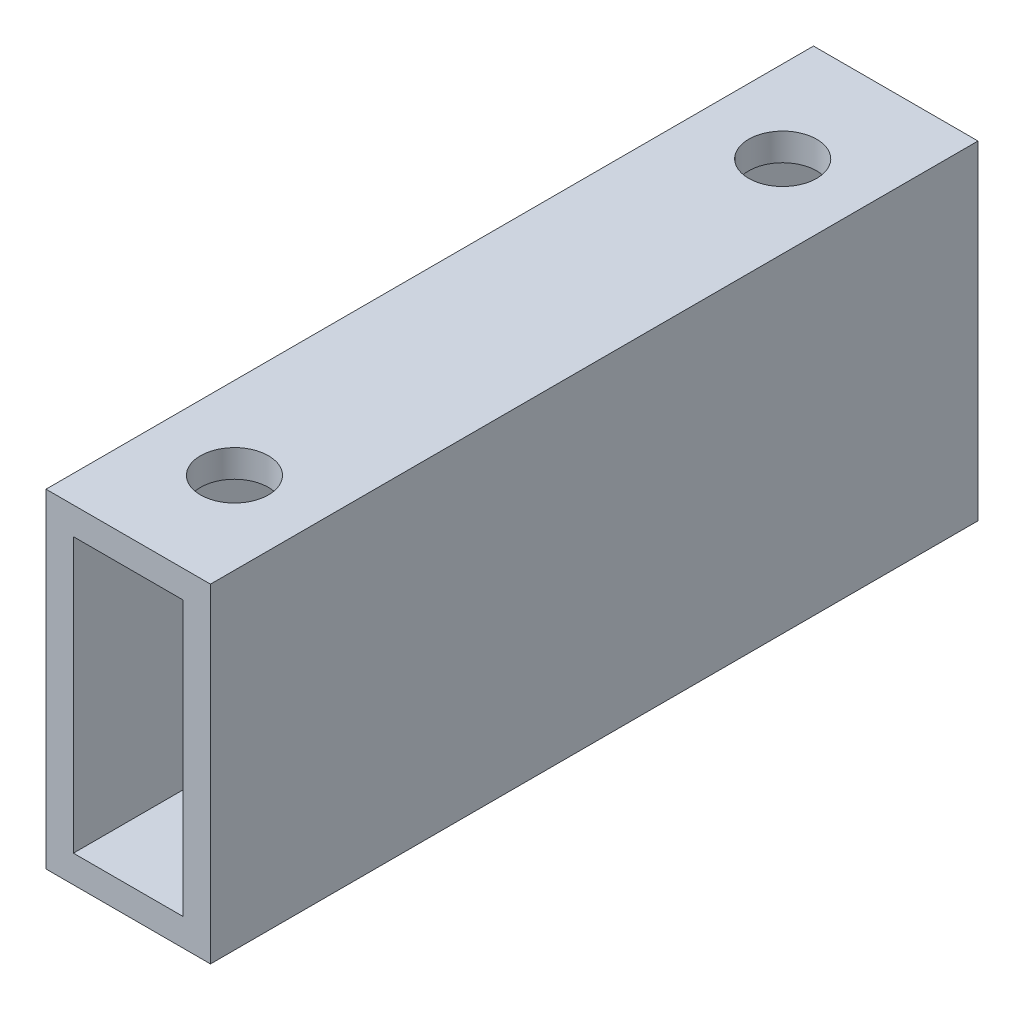
ISO-10303-21;
HEADER;
FILE_DESCRIPTION(('STEP AP214'),'2;1');
FILE_NAME('part.step','',(''),(''),'','','');
FILE_SCHEMA(('AUTOMOTIVE_DESIGN { 1 0 10303 214 1 1 1 1 }'));
ENDSEC;
DATA;
#1=APPLICATION_CONTEXT('core data for automotive mechanical design processes');
#2=APPLICATION_PROTOCOL_DEFINITION('international standard','automotive_design',2000,#1);
#3=PRODUCT_CONTEXT('',#1,'mechanical');
#4=PRODUCT('Part','Part','',(#3));
#5=PRODUCT_RELATED_PRODUCT_CATEGORY('part','',(#4));
#6=PRODUCT_DEFINITION_FORMATION('','',#4);
#7=PRODUCT_DEFINITION_CONTEXT('part definition',#1,'design');
#8=PRODUCT_DEFINITION('design','',#6,#7);
#9=PRODUCT_DEFINITION_SHAPE('','',#8);
#10=(LENGTH_UNIT() NAMED_UNIT(*) SI_UNIT(.MILLI.,.METRE.));
#11=(NAMED_UNIT(*) PLANE_ANGLE_UNIT() SI_UNIT($,.RADIAN.));
#12=(NAMED_UNIT(*) SI_UNIT($,.STERADIAN.) SOLID_ANGLE_UNIT());
#13=UNCERTAINTY_MEASURE_WITH_UNIT(LENGTH_MEASURE(1.E-05),#10,'distance_accuracy_value','');
#14=(GEOMETRIC_REPRESENTATION_CONTEXT(3) GLOBAL_UNCERTAINTY_ASSIGNED_CONTEXT((#13)) GLOBAL_UNIT_ASSIGNED_CONTEXT((#10,
#11,#12)) REPRESENTATION_CONTEXT('',''));
#15=CARTESIAN_POINT('',(0.,0.,0.));
#16=DIRECTION('',(0.,0.,1.));
#17=DIRECTION('',(1.,0.,0.));
#18=AXIS2_PLACEMENT_3D('',#15,#16,#17);
#19=CARTESIAN_POINT('',(0.,0.,88.9));
#20=DIRECTION('',(0.,0.,-1.));
#21=DIRECTION('',(-1.,0.,0.));
#22=AXIS2_PLACEMENT_3D('',#19,#20,#21);
#23=PLANE('',#22);
#24=DIRECTION('',(0.,1.,0.));
#25=VECTOR('',#24,1.);
#26=CARTESIAN_POINT('',(9.525,-19.05,88.9));
#27=LINE('',#26,#25);
#28=CARTESIAN_POINT('',(9.525,-19.05,88.9));
#29=VERTEX_POINT('',#28);
#30=CARTESIAN_POINT('',(9.525,19.05,88.9));
#31=VERTEX_POINT('',#30);
#32=EDGE_CURVE('E136',#29,#31,#27,.T.);
#33=ORIENTED_EDGE('',*,*,#32,.T.);
#34=DIRECTION('',(-1.,0.,0.));
#35=VECTOR('',#34,1.);
#36=CARTESIAN_POINT('',(-9.525,19.05,88.9));
#37=LINE('',#36,#35);
#38=CARTESIAN_POINT('',(-9.525,19.05,88.9));
#39=VERTEX_POINT('',#38);
#40=EDGE_CURVE('E139',#31,#39,#37,.T.);
#41=ORIENTED_EDGE('',*,*,#40,.T.);
#42=DIRECTION('',(0.,-1.,0.));
#43=VECTOR('',#42,1.);
#44=CARTESIAN_POINT('',(-9.525,-19.05,88.9));
#45=LINE('',#44,#43);
#46=CARTESIAN_POINT('',(-9.525,-19.05,88.9));
#47=VERTEX_POINT('',#46);
#48=EDGE_CURVE('E142',#39,#47,#45,.T.);
#49=ORIENTED_EDGE('',*,*,#48,.T.);
#50=DIRECTION('',(1.,0.,0.));
#51=VECTOR('',#50,1.);
#52=CARTESIAN_POINT('',(-9.525,-19.05,88.9));
#53=LINE('',#52,#51);
#54=EDGE_CURVE('E144',#47,#29,#53,.T.);
#55=ORIENTED_EDGE('',*,*,#54,.T.);
#56=EDGE_LOOP('',(#33,#41,#49,#55));
#57=FACE_BOUND('',#56,.T.);
#58=DIRECTION('',(1.,0.,0.));
#59=VECTOR('',#58,1.);
#60=CARTESIAN_POINT('',(-6.35,-15.875,88.9));
#61=LINE('',#60,#59);
#62=CARTESIAN_POINT('',(-6.35,-15.875,88.9));
#63=VERTEX_POINT('',#62);
#64=CARTESIAN_POINT('',(6.35,-15.875,88.9));
#65=VERTEX_POINT('',#64);
#66=EDGE_CURVE('E98',#63,#65,#61,.T.);
#67=ORIENTED_EDGE('',*,*,#66,.F.);
#68=DIRECTION('',(0.,-1.,0.));
#69=VECTOR('',#68,1.);
#70=CARTESIAN_POINT('',(-6.35,-15.875,88.9));
#71=LINE('',#70,#69);
#72=CARTESIAN_POINT('',(-6.35,15.875,88.9));
#73=VERTEX_POINT('',#72);
#74=EDGE_CURVE('E120',#73,#63,#71,.T.);
#75=ORIENTED_EDGE('',*,*,#74,.F.);
#76=DIRECTION('',(-1.,0.,0.));
#77=VECTOR('',#76,1.);
#78=CARTESIAN_POINT('',(-6.35,15.875,88.9));
#79=LINE('',#78,#77);
#80=CARTESIAN_POINT('',(6.35,15.875,88.9));
#81=VERTEX_POINT('',#80);
#82=EDGE_CURVE('E118',#81,#73,#79,.T.);
#83=ORIENTED_EDGE('',*,*,#82,.F.);
#84=DIRECTION('',(0.,1.,0.));
#85=VECTOR('',#84,1.);
#86=CARTESIAN_POINT('',(6.35,-15.875,88.9));
#87=LINE('',#86,#85);
#88=EDGE_CURVE('E106',#65,#81,#87,.T.);
#89=ORIENTED_EDGE('',*,*,#88,.F.);
#90=EDGE_LOOP('',(#67,#75,#83,#89));
#91=FACE_BOUND('',#90,.T.);
#92=ADVANCED_FACE('F33',(#57,#91),#23,.F.);
#93=CARTESIAN_POINT('',(0.,0.,0.));
#94=DIRECTION('',(0.,0.,-1.));
#95=DIRECTION('',(-1.,0.,0.));
#96=AXIS2_PLACEMENT_3D('',#93,#94,#95);
#97=PLANE('',#96);
#98=DIRECTION('',(0.,1.,0.));
#99=VECTOR('',#98,1.);
#100=CARTESIAN_POINT('',(9.525,-19.05,0.));
#101=LINE('',#100,#99);
#102=CARTESIAN_POINT('',(9.525,-19.05,0.));
#103=VERTEX_POINT('',#102);
#104=CARTESIAN_POINT('',(9.525,19.05,0.));
#105=VERTEX_POINT('',#104);
#106=EDGE_CURVE('E114',#103,#105,#101,.T.);
#107=ORIENTED_EDGE('',*,*,#106,.F.);
#108=DIRECTION('',(1.,0.,0.));
#109=VECTOR('',#108,1.);
#110=CARTESIAN_POINT('',(-9.525,-19.05,0.));
#111=LINE('',#110,#109);
#112=CARTESIAN_POINT('',(-9.525,-19.05,0.));
#113=VERTEX_POINT('',#112);
#114=EDGE_CURVE('E140',#113,#103,#111,.T.);
#115=ORIENTED_EDGE('',*,*,#114,.F.);
#116=DIRECTION('',(0.,-1.,0.));
#117=VECTOR('',#116,1.);
#118=CARTESIAN_POINT('',(-9.525,-19.05,0.));
#119=LINE('',#118,#117);
#120=CARTESIAN_POINT('',(-9.525,19.05,0.));
#121=VERTEX_POINT('',#120);
#122=EDGE_CURVE('E151',#121,#113,#119,.T.);
#123=ORIENTED_EDGE('',*,*,#122,.F.);
#124=DIRECTION('',(-1.,0.,0.));
#125=VECTOR('',#124,1.);
#126=CARTESIAN_POINT('',(-9.525,19.05,0.));
#127=LINE('',#126,#125);
#128=EDGE_CURVE('E149',#105,#121,#127,.T.);
#129=ORIENTED_EDGE('',*,*,#128,.F.);
#130=EDGE_LOOP('',(#107,#115,#123,#129));
#131=FACE_BOUND('',#130,.T.);
#132=DIRECTION('',(0.,-1.,0.));
#133=VECTOR('',#132,1.);
#134=CARTESIAN_POINT('',(-6.35,-15.875,0.));
#135=LINE('',#134,#133);
#136=CARTESIAN_POINT('',(-6.35,15.875,0.));
#137=VERTEX_POINT('',#136);
#138=CARTESIAN_POINT('',(-6.35,-15.875,0.));
#139=VERTEX_POINT('',#138);
#140=EDGE_CURVE('E107',#137,#139,#135,.T.);
#141=ORIENTED_EDGE('',*,*,#140,.T.);
#142=DIRECTION('',(1.,0.,0.));
#143=VECTOR('',#142,1.);
#144=CARTESIAN_POINT('',(-6.35,-15.875,0.));
#145=LINE('',#144,#143);
#146=CARTESIAN_POINT('',(6.35,-15.875,0.));
#147=VERTEX_POINT('',#146);
#148=EDGE_CURVE('E56',#139,#147,#145,.T.);
#149=ORIENTED_EDGE('',*,*,#148,.T.);
#150=DIRECTION('',(0.,1.,0.));
#151=VECTOR('',#150,1.);
#152=CARTESIAN_POINT('',(6.35,-15.875,0.));
#153=LINE('',#152,#151);
#154=CARTESIAN_POINT('',(6.35,15.875,0.));
#155=VERTEX_POINT('',#154);
#156=EDGE_CURVE('E113',#147,#155,#153,.T.);
#157=ORIENTED_EDGE('',*,*,#156,.T.);
#158=DIRECTION('',(-1.,0.,0.));
#159=VECTOR('',#158,1.);
#160=CARTESIAN_POINT('',(-6.35,15.875,0.));
#161=LINE('',#160,#159);
#162=EDGE_CURVE('E128',#155,#137,#161,.T.);
#163=ORIENTED_EDGE('',*,*,#162,.T.);
#164=EDGE_LOOP('',(#141,#149,#157,#163));
#165=FACE_BOUND('',#164,.T.);
#166=ADVANCED_FACE('F169',(#131,#165),#97,.T.);
#167=CARTESIAN_POINT('',(9.525,-19.05,88.9));
#168=DIRECTION('',(-1.,0.,0.));
#169=DIRECTION('',(0.,0.,1.));
#170=AXIS2_PLACEMENT_3D('',#167,#168,#169);
#171=PLANE('',#170);
#172=ORIENTED_EDGE('',*,*,#106,.T.);
#173=DIRECTION('',(0.,0.,-1.));
#174=VECTOR('',#173,1.);
#175=CARTESIAN_POINT('',(9.525,19.05,88.9));
#176=LINE('',#175,#174);
#177=EDGE_CURVE('E11',#31,#105,#176,.T.);
#178=ORIENTED_EDGE('',*,*,#177,.F.);
#179=ORIENTED_EDGE('',*,*,#32,.F.);
#180=DIRECTION('',(0.,0.,-1.));
#181=VECTOR('',#180,1.);
#182=CARTESIAN_POINT('',(9.525,-19.05,88.9));
#183=LINE('',#182,#181);
#184=EDGE_CURVE('E146',#29,#103,#183,.T.);
#185=ORIENTED_EDGE('',*,*,#184,.T.);
#186=EDGE_LOOP('',(#172,#178,#179,#185));
#187=FACE_BOUND('',#186,.T.);
#188=ADVANCED_FACE('F35',(#187),#171,.F.);
#189=CARTESIAN_POINT('',(-9.525,19.05,88.9));
#190=DIRECTION('',(0.,-1.,0.));
#191=DIRECTION('',(0.,0.,-1.));
#192=AXIS2_PLACEMENT_3D('',#189,#190,#191);
#193=PLANE('',#192);
#194=CARTESIAN_POINT('',(0.,19.05,13.096875));
#195=DIRECTION('',(0.,1.,0.));
#196=DIRECTION('',(0.,0.,1.));
#197=AXIS2_PLACEMENT_3D('',#194,#195,#196);
#198=CIRCLE('',#197,3.937);
#199=CARTESIAN_POINT('',(0.,19.05,17.033875));
#200=VERTEX_POINT('',#199);
#201=EDGE_CURVE('E223',#200,#200,#198,.T.);
#202=ORIENTED_EDGE('',*,*,#201,.F.);
#203=EDGE_LOOP('',(#202));
#204=FACE_BOUND('',#203,.T.);
#205=CARTESIAN_POINT('',(0.,19.05,76.596875));
#206=DIRECTION('',(0.,1.,0.));
#207=DIRECTION('',(0.,0.,1.));
#208=AXIS2_PLACEMENT_3D('',#205,#206,#207);
#209=CIRCLE('',#208,3.937);
#210=CARTESIAN_POINT('',(0.,19.05,80.533875));
#211=VERTEX_POINT('',#210);
#212=EDGE_CURVE('E219',#211,#211,#209,.T.);
#213=ORIENTED_EDGE('',*,*,#212,.F.);
#214=EDGE_LOOP('',(#213));
#215=FACE_BOUND('',#214,.T.);
#216=ORIENTED_EDGE('',*,*,#128,.T.);
#217=DIRECTION('',(0.,0.,-1.));
#218=VECTOR('',#217,1.);
#219=CARTESIAN_POINT('',(-9.525,19.05,88.9));
#220=LINE('',#219,#218);
#221=EDGE_CURVE('E41',#39,#121,#220,.T.);
#222=ORIENTED_EDGE('',*,*,#221,.F.);
#223=ORIENTED_EDGE('',*,*,#40,.F.);
#224=ORIENTED_EDGE('',*,*,#177,.T.);
#225=EDGE_LOOP('',(#216,#222,#223,#224));
#226=FACE_BOUND('',#225,.T.);
#227=ADVANCED_FACE('F179',(#204,#215,#226),#193,.F.);
#228=CARTESIAN_POINT('',(-9.525,-19.05,88.9));
#229=DIRECTION('',(1.,0.,0.));
#230=DIRECTION('',(0.,0.,-1.));
#231=AXIS2_PLACEMENT_3D('',#228,#229,#230);
#232=PLANE('',#231);
#233=ORIENTED_EDGE('',*,*,#122,.T.);
#234=DIRECTION('',(0.,0.,-1.));
#235=VECTOR('',#234,1.);
#236=CARTESIAN_POINT('',(-9.525,-19.05,88.9));
#237=LINE('',#236,#235);
#238=EDGE_CURVE('E156',#47,#113,#237,.T.);
#239=ORIENTED_EDGE('',*,*,#238,.F.);
#240=ORIENTED_EDGE('',*,*,#48,.F.);
#241=ORIENTED_EDGE('',*,*,#221,.T.);
#242=EDGE_LOOP('',(#233,#239,#240,#241));
#243=FACE_BOUND('',#242,.T.);
#244=ADVANCED_FACE('F163',(#243),#232,.F.);
#245=CARTESIAN_POINT('',(-9.525,-19.05,88.9));
#246=DIRECTION('',(0.,1.,0.));
#247=DIRECTION('',(0.,0.,1.));
#248=AXIS2_PLACEMENT_3D('',#245,#246,#247);
#249=PLANE('',#248);
#250=CARTESIAN_POINT('',(0.,-19.05,13.096875));
#251=DIRECTION('',(0.,1.,0.));
#252=DIRECTION('',(0.,0.,1.));
#253=AXIS2_PLACEMENT_3D('',#250,#251,#252);
#254=CIRCLE('',#253,2.778125);
#255=CARTESIAN_POINT('',(0.,-19.05,15.875));
#256=VERTEX_POINT('',#255);
#257=EDGE_CURVE('E207',#256,#256,#254,.T.);
#258=ORIENTED_EDGE('',*,*,#257,.T.);
#259=EDGE_LOOP('',(#258));
#260=FACE_BOUND('',#259,.T.);
#261=CARTESIAN_POINT('',(0.,-19.05,76.596875));
#262=DIRECTION('',(0.,1.,0.));
#263=DIRECTION('',(0.,0.,1.));
#264=AXIS2_PLACEMENT_3D('',#261,#262,#263);
#265=CIRCLE('',#264,2.778125);
#266=CARTESIAN_POINT('',(0.,-19.05,79.375));
#267=VERTEX_POINT('',#266);
#268=EDGE_CURVE('E210',#267,#267,#265,.T.);
#269=ORIENTED_EDGE('',*,*,#268,.T.);
#270=EDGE_LOOP('',(#269));
#271=FACE_BOUND('',#270,.T.);
#272=ORIENTED_EDGE('',*,*,#114,.T.);
#273=ORIENTED_EDGE('',*,*,#184,.F.);
#274=ORIENTED_EDGE('',*,*,#54,.F.);
#275=ORIENTED_EDGE('',*,*,#238,.T.);
#276=EDGE_LOOP('',(#272,#273,#274,#275));
#277=FACE_BOUND('',#276,.T.);
#278=ADVANCED_FACE('F173',(#260,#271,#277),#249,.F.);
#279=CARTESIAN_POINT('',(-6.35,-15.875,88.9));
#280=DIRECTION('',(0.,1.,0.));
#281=DIRECTION('',(0.,0.,1.));
#282=AXIS2_PLACEMENT_3D('',#279,#280,#281);
#283=PLANE('',#282);
#284=CARTESIAN_POINT('',(0.,-15.875,13.096875));
#285=DIRECTION('',(0.,1.,0.));
#286=DIRECTION('',(0.,0.,1.));
#287=AXIS2_PLACEMENT_3D('',#284,#285,#286);
#288=CIRCLE('',#287,2.778125);
#289=CARTESIAN_POINT('',(0.,-15.875,15.875));
#290=VERTEX_POINT('',#289);
#291=EDGE_CURVE('E212',#290,#290,#288,.T.);
#292=ORIENTED_EDGE('',*,*,#291,.F.);
#293=EDGE_LOOP('',(#292));
#294=FACE_BOUND('',#293,.T.);
#295=CARTESIAN_POINT('',(0.,-15.875,76.596875));
#296=DIRECTION('',(0.,1.,0.));
#297=DIRECTION('',(0.,0.,1.));
#298=AXIS2_PLACEMENT_3D('',#295,#296,#297);
#299=CIRCLE('',#298,2.778125);
#300=CARTESIAN_POINT('',(0.,-15.875,79.375));
#301=VERTEX_POINT('',#300);
#302=EDGE_CURVE('E126',#301,#301,#299,.T.);
#303=ORIENTED_EDGE('',*,*,#302,.F.);
#304=EDGE_LOOP('',(#303));
#305=FACE_BOUND('',#304,.T.);
#306=ORIENTED_EDGE('',*,*,#148,.F.);
#307=DIRECTION('',(0.,0.,-1.));
#308=VECTOR('',#307,1.);
#309=CARTESIAN_POINT('',(-6.35,-15.875,88.9));
#310=LINE('',#309,#308);
#311=EDGE_CURVE('E102',#63,#139,#310,.T.);
#312=ORIENTED_EDGE('',*,*,#311,.F.);
#313=ORIENTED_EDGE('',*,*,#66,.T.);
#314=DIRECTION('',(0.,0.,-1.));
#315=VECTOR('',#314,1.);
#316=CARTESIAN_POINT('',(6.35,-15.875,88.9));
#317=LINE('',#316,#315);
#318=EDGE_CURVE('E101',#65,#147,#317,.T.);
#319=ORIENTED_EDGE('',*,*,#318,.T.);
#320=EDGE_LOOP('',(#306,#312,#313,#319));
#321=FACE_BOUND('',#320,.T.);
#322=ADVANCED_FACE('F100',(#294,#305,#321),#283,.T.);
#323=CARTESIAN_POINT('',(6.35,-15.875,88.9));
#324=DIRECTION('',(-1.,0.,0.));
#325=DIRECTION('',(0.,-1.,0.));
#326=AXIS2_PLACEMENT_3D('',#323,#324,#325);
#327=PLANE('',#326);
#328=ORIENTED_EDGE('',*,*,#156,.F.);
#329=ORIENTED_EDGE('',*,*,#318,.F.);
#330=ORIENTED_EDGE('',*,*,#88,.T.);
#331=DIRECTION('',(0.,0.,-1.));
#332=VECTOR('',#331,1.);
#333=CARTESIAN_POINT('',(6.35,15.875,88.9));
#334=LINE('',#333,#332);
#335=EDGE_CURVE('E115',#81,#155,#334,.T.);
#336=ORIENTED_EDGE('',*,*,#335,.T.);
#337=EDGE_LOOP('',(#328,#329,#330,#336));
#338=FACE_BOUND('',#337,.T.);
#339=ADVANCED_FACE('F110',(#338),#327,.T.);
#340=CARTESIAN_POINT('',(-6.35,15.875,88.9));
#341=DIRECTION('',(0.,-1.,0.));
#342=DIRECTION('',(1.,0.,0.));
#343=AXIS2_PLACEMENT_3D('',#340,#341,#342);
#344=PLANE('',#343);
#345=CARTESIAN_POINT('',(0.,15.875,13.096875));
#346=DIRECTION('',(0.,-1.,0.));
#347=DIRECTION('',(1.,0.,0.));
#348=AXIS2_PLACEMENT_3D('',#345,#346,#347);
#349=CIRCLE('',#348,3.937);
#350=CARTESIAN_POINT('',(3.937,15.875,13.096875));
#351=VERTEX_POINT('',#350);
#352=EDGE_CURVE('E226',#351,#351,#349,.F.);
#353=ORIENTED_EDGE('',*,*,#352,.T.);
#354=EDGE_LOOP('',(#353));
#355=FACE_BOUND('',#354,.T.);
#356=CARTESIAN_POINT('',(0.,15.875,76.596875));
#357=DIRECTION('',(0.,-1.,0.));
#358=DIRECTION('',(1.,0.,0.));
#359=AXIS2_PLACEMENT_3D('',#356,#357,#358);
#360=CIRCLE('',#359,3.937);
#361=CARTESIAN_POINT('',(3.937,15.875,76.596875));
#362=VERTEX_POINT('',#361);
#363=EDGE_CURVE('E220',#362,#362,#360,.F.);
#364=ORIENTED_EDGE('',*,*,#363,.T.);
#365=EDGE_LOOP('',(#364));
#366=FACE_BOUND('',#365,.T.);
#367=ORIENTED_EDGE('',*,*,#162,.F.);
#368=ORIENTED_EDGE('',*,*,#335,.F.);
#369=ORIENTED_EDGE('',*,*,#82,.T.);
#370=DIRECTION('',(0.,0.,-1.));
#371=VECTOR('',#370,1.);
#372=CARTESIAN_POINT('',(-6.35,15.875,88.9));
#373=LINE('',#372,#371);
#374=EDGE_CURVE('E48',#73,#137,#373,.T.);
#375=ORIENTED_EDGE('',*,*,#374,.T.);
#376=EDGE_LOOP('',(#367,#368,#369,#375));
#377=FACE_BOUND('',#376,.T.);
#378=ADVANCED_FACE('F254',(#355,#366,#377),#344,.T.);
#379=CARTESIAN_POINT('',(-6.35,-15.875,88.9));
#380=DIRECTION('',(1.,0.,0.));
#381=DIRECTION('',(0.,0.,-1.));
#382=AXIS2_PLACEMENT_3D('',#379,#380,#381);
#383=PLANE('',#382);
#384=ORIENTED_EDGE('',*,*,#140,.F.);
#385=ORIENTED_EDGE('',*,*,#374,.F.);
#386=ORIENTED_EDGE('',*,*,#74,.T.);
#387=ORIENTED_EDGE('',*,*,#311,.T.);
#388=EDGE_LOOP('',(#384,#385,#386,#387));
#389=FACE_BOUND('',#388,.T.);
#390=ADVANCED_FACE('F250',(#389),#383,.T.);
#391=CARTESIAN_POINT('',(0.,-19.05,76.596875));
#392=DIRECTION('',(0.,1.,0.));
#393=DIRECTION('',(0.,0.,1.));
#394=AXIS2_PLACEMENT_3D('',#391,#392,#393);
#395=CYLINDRICAL_SURFACE('',#394,2.778125);
#396=CARTESIAN_POINT('',(0.,-15.875,79.375));
#397=CARTESIAN_POINT('',(0.,-15.9080729166667,79.375));
#398=CARTESIAN_POINT('',(0.,-15.9411458333333,79.375));
#399=CARTESIAN_POINT('',(0.,-16.0072916666667,79.375));
#400=CARTESIAN_POINT('',(0.,-16.0403645833333,79.375));
#401=CARTESIAN_POINT('',(0.,-16.1065104166667,79.375));
#402=CARTESIAN_POINT('',(0.,-16.1395833333333,79.375));
#403=CARTESIAN_POINT('',(0.,-16.2057291666667,79.375));
#404=CARTESIAN_POINT('',(0.,-16.2388020833333,79.375));
#405=CARTESIAN_POINT('',(0.,-16.3049479166667,79.375));
#406=CARTESIAN_POINT('',(0.,-16.3380208333333,79.375));
#407=CARTESIAN_POINT('',(0.,-16.4041666666667,79.375));
#408=CARTESIAN_POINT('',(0.,-16.4372395833333,79.375));
#409=CARTESIAN_POINT('',(0.,-16.5033854166667,79.375));
#410=CARTESIAN_POINT('',(0.,-16.5364583333333,79.375));
#411=CARTESIAN_POINT('',(0.,-16.6026041666667,79.375));
#412=CARTESIAN_POINT('',(0.,-16.6356770833333,79.375));
#413=CARTESIAN_POINT('',(0.,-16.7018229166667,79.375));
#414=CARTESIAN_POINT('',(0.,-16.7348958333333,79.375));
#415=CARTESIAN_POINT('',(0.,-16.8010416666667,79.375));
#416=CARTESIAN_POINT('',(0.,-16.8341145833333,79.375));
#417=CARTESIAN_POINT('',(0.,-16.9002604166667,79.375));
#418=CARTESIAN_POINT('',(0.,-16.9333333333333,79.375));
#419=CARTESIAN_POINT('',(0.,-16.9994791666667,79.375));
#420=CARTESIAN_POINT('',(0.,-17.0325520833333,79.375));
#421=CARTESIAN_POINT('',(0.,-17.0986979166667,79.375));
#422=CARTESIAN_POINT('',(0.,-17.1317708333333,79.375));
#423=CARTESIAN_POINT('',(0.,-17.1979166666667,79.375));
#424=CARTESIAN_POINT('',(0.,-17.2309895833333,79.375));
#425=CARTESIAN_POINT('',(0.,-17.2971354166667,79.375));
#426=CARTESIAN_POINT('',(0.,-17.3302083333333,79.375));
#427=CARTESIAN_POINT('',(0.,-17.3963541666667,79.375));
#428=CARTESIAN_POINT('',(0.,-17.4294270833333,79.375));
#429=CARTESIAN_POINT('',(0.,-17.4955729166667,79.375));
#430=CARTESIAN_POINT('',(0.,-17.5286458333333,79.375));
#431=CARTESIAN_POINT('',(0.,-17.5947916666667,79.375));
#432=CARTESIAN_POINT('',(0.,-17.6278645833333,79.375));
#433=CARTESIAN_POINT('',(0.,-17.6940104166667,79.375));
#434=CARTESIAN_POINT('',(0.,-17.7270833333333,79.375));
#435=CARTESIAN_POINT('',(0.,-17.7932291666667,79.375));
#436=CARTESIAN_POINT('',(0.,-17.8263020833333,79.375));
#437=CARTESIAN_POINT('',(0.,-17.8924479166667,79.375));
#438=CARTESIAN_POINT('',(0.,-17.9255208333333,79.375));
#439=CARTESIAN_POINT('',(0.,-17.9916666666667,79.375));
#440=CARTESIAN_POINT('',(0.,-18.0247395833333,79.375));
#441=CARTESIAN_POINT('',(0.,-18.0908854166667,79.375));
#442=CARTESIAN_POINT('',(0.,-18.1239583333333,79.375));
#443=CARTESIAN_POINT('',(0.,-18.1901041666667,79.375));
#444=CARTESIAN_POINT('',(0.,-18.2231770833333,79.375));
#445=CARTESIAN_POINT('',(0.,-18.2893229166667,79.375));
#446=CARTESIAN_POINT('',(0.,-18.3223958333333,79.375));
#447=CARTESIAN_POINT('',(0.,-18.3885416666667,79.375));
#448=CARTESIAN_POINT('',(0.,-18.4216145833333,79.375));
#449=CARTESIAN_POINT('',(0.,-18.4877604166667,79.375));
#450=CARTESIAN_POINT('',(0.,-18.5208333333333,79.375));
#451=CARTESIAN_POINT('',(0.,-18.5869791666667,79.375));
#452=CARTESIAN_POINT('',(0.,-18.6200520833333,79.375));
#453=CARTESIAN_POINT('',(0.,-18.6861979166667,79.375));
#454=CARTESIAN_POINT('',(0.,-18.7192708333333,79.375));
#455=CARTESIAN_POINT('',(0.,-18.7854166666667,79.375));
#456=CARTESIAN_POINT('',(0.,-18.8184895833333,79.375));
#457=CARTESIAN_POINT('',(0.,-18.8846354166667,79.375));
#458=CARTESIAN_POINT('',(0.,-18.9177083333333,79.375));
#459=CARTESIAN_POINT('',(0.,-18.9838541666667,79.375));
#460=CARTESIAN_POINT('',(0.,-19.0169270833333,79.375));
#461=CARTESIAN_POINT('',(0.,-19.05,79.375));
#462=B_SPLINE_CURVE_WITH_KNOTS('',3,(#396,#397,#398,#399,#400,#401,#402,#403,#404,#405,#406,
#407,#408,#409,#410,#411,#412,#413,#414,#415,#416,#417,#418,#419,#420,#421,#422,#423,#424,#425,
#426,#427,#428,#429,#430,#431,#432,#433,#434,#435,#436,#437,#438,#439,#440,#441,#442,#443,#444,
#445,#446,#447,#448,#449,#450,#451,#452,#453,#454,#455,#456,#457,#458,#459,#460,#461),
.UNSPECIFIED.,.F.,.F.,(4,2,2,2,2,2,2,2,2,2,2,2,2,2,2,2,2,2,2,2,2,2,2,2,2,2,2,2,2,2,2,2,4),(0.,
0.0992187499999977,0.198437499999999,0.29765625,0.396874999999998,0.496093749999999,0.5953125,
0.694531249999998,0.793749999999999,0.892968749999997,0.992187499999998,1.09140625,1.190625,
1.28984375,1.3890625,1.48828125,1.5875,1.68671875,1.7859375,1.88515625,1.984375,2.08359375,
2.1828125,2.28203125,2.38125,2.48046875,2.5796875,2.67890625,2.778125,2.87734375,2.9765625,
3.07578125,3.175),.UNSPECIFIED.);
#463=EDGE_CURVE('BSEAM246',#301,#267,#462,.T.);
#464=ORIENTED_EDGE('',*,*,#302,.T.);
#465=ORIENTED_EDGE('',*,*,#268,.F.);
#466=ORIENTED_EDGE('',*,*,#463,.T.);
#467=ORIENTED_EDGE('',*,*,#463,.F.);
#468=EDGE_LOOP('',(#464,#466,#465,#467));
#469=FACE_BOUND('',#468,.T.);
#470=ADVANCED_FACE('F246',(#469),#395,.F.);
#471=CARTESIAN_POINT('',(0.,-19.05,13.096875));
#472=DIRECTION('',(0.,1.,0.));
#473=DIRECTION('',(0.,0.,1.));
#474=AXIS2_PLACEMENT_3D('',#471,#472,#473);
#475=CYLINDRICAL_SURFACE('',#474,2.778125);
#476=CARTESIAN_POINT('',(0.,-15.875,15.875));
#477=CARTESIAN_POINT('',(0.,-15.9080729166667,15.875));
#478=CARTESIAN_POINT('',(0.,-15.9411458333333,15.875));
#479=CARTESIAN_POINT('',(0.,-16.0072916666667,15.875));
#480=CARTESIAN_POINT('',(0.,-16.0403645833333,15.875));
#481=CARTESIAN_POINT('',(0.,-16.1065104166667,15.875));
#482=CARTESIAN_POINT('',(0.,-16.1395833333333,15.875));
#483=CARTESIAN_POINT('',(0.,-16.2057291666667,15.875));
#484=CARTESIAN_POINT('',(0.,-16.2388020833333,15.875));
#485=CARTESIAN_POINT('',(0.,-16.3049479166667,15.875));
#486=CARTESIAN_POINT('',(0.,-16.3380208333333,15.875));
#487=CARTESIAN_POINT('',(0.,-16.4041666666667,15.875));
#488=CARTESIAN_POINT('',(0.,-16.4372395833333,15.875));
#489=CARTESIAN_POINT('',(0.,-16.5033854166667,15.875));
#490=CARTESIAN_POINT('',(0.,-16.5364583333333,15.875));
#491=CARTESIAN_POINT('',(0.,-16.6026041666667,15.875));
#492=CARTESIAN_POINT('',(0.,-16.6356770833333,15.875));
#493=CARTESIAN_POINT('',(0.,-16.7018229166667,15.875));
#494=CARTESIAN_POINT('',(0.,-16.7348958333333,15.875));
#495=CARTESIAN_POINT('',(0.,-16.8010416666667,15.875));
#496=CARTESIAN_POINT('',(0.,-16.8341145833333,15.875));
#497=CARTESIAN_POINT('',(0.,-16.9002604166667,15.875));
#498=CARTESIAN_POINT('',(0.,-16.9333333333333,15.875));
#499=CARTESIAN_POINT('',(0.,-16.9994791666667,15.875));
#500=CARTESIAN_POINT('',(0.,-17.0325520833333,15.875));
#501=CARTESIAN_POINT('',(0.,-17.0986979166667,15.875));
#502=CARTESIAN_POINT('',(0.,-17.1317708333333,15.875));
#503=CARTESIAN_POINT('',(0.,-17.1979166666667,15.875));
#504=CARTESIAN_POINT('',(0.,-17.2309895833333,15.875));
#505=CARTESIAN_POINT('',(0.,-17.2971354166667,15.875));
#506=CARTESIAN_POINT('',(0.,-17.3302083333333,15.875));
#507=CARTESIAN_POINT('',(0.,-17.3963541666667,15.875));
#508=CARTESIAN_POINT('',(0.,-17.4294270833333,15.875));
#509=CARTESIAN_POINT('',(0.,-17.4955729166667,15.875));
#510=CARTESIAN_POINT('',(0.,-17.5286458333333,15.875));
#511=CARTESIAN_POINT('',(0.,-17.5947916666667,15.875));
#512=CARTESIAN_POINT('',(0.,-17.6278645833333,15.875));
#513=CARTESIAN_POINT('',(0.,-17.6940104166667,15.875));
#514=CARTESIAN_POINT('',(0.,-17.7270833333333,15.875));
#515=CARTESIAN_POINT('',(0.,-17.7932291666667,15.875));
#516=CARTESIAN_POINT('',(0.,-17.8263020833333,15.875));
#517=CARTESIAN_POINT('',(0.,-17.8924479166667,15.875));
#518=CARTESIAN_POINT('',(0.,-17.9255208333333,15.875));
#519=CARTESIAN_POINT('',(0.,-17.9916666666667,15.875));
#520=CARTESIAN_POINT('',(0.,-18.0247395833333,15.875));
#521=CARTESIAN_POINT('',(0.,-18.0908854166667,15.875));
#522=CARTESIAN_POINT('',(0.,-18.1239583333333,15.875));
#523=CARTESIAN_POINT('',(0.,-18.1901041666667,15.875));
#524=CARTESIAN_POINT('',(0.,-18.2231770833333,15.875));
#525=CARTESIAN_POINT('',(0.,-18.2893229166667,15.875));
#526=CARTESIAN_POINT('',(0.,-18.3223958333333,15.875));
#527=CARTESIAN_POINT('',(0.,-18.3885416666667,15.875));
#528=CARTESIAN_POINT('',(0.,-18.4216145833333,15.875));
#529=CARTESIAN_POINT('',(0.,-18.4877604166667,15.875));
#530=CARTESIAN_POINT('',(0.,-18.5208333333333,15.875));
#531=CARTESIAN_POINT('',(0.,-18.5869791666667,15.875));
#532=CARTESIAN_POINT('',(0.,-18.6200520833333,15.875));
#533=CARTESIAN_POINT('',(0.,-18.6861979166667,15.875));
#534=CARTESIAN_POINT('',(0.,-18.7192708333333,15.875));
#535=CARTESIAN_POINT('',(0.,-18.7854166666667,15.875));
#536=CARTESIAN_POINT('',(0.,-18.8184895833333,15.875));
#537=CARTESIAN_POINT('',(0.,-18.8846354166667,15.875));
#538=CARTESIAN_POINT('',(0.,-18.9177083333333,15.875));
#539=CARTESIAN_POINT('',(0.,-18.9838541666667,15.875));
#540=CARTESIAN_POINT('',(0.,-19.0169270833333,15.875));
#541=CARTESIAN_POINT('',(0.,-19.05,15.875));
#542=B_SPLINE_CURVE_WITH_KNOTS('',3,(#476,#477,#478,#479,#480,#481,#482,#483,#484,#485,#486,
#487,#488,#489,#490,#491,#492,#493,#494,#495,#496,#497,#498,#499,#500,#501,#502,#503,#504,#505,
#506,#507,#508,#509,#510,#511,#512,#513,#514,#515,#516,#517,#518,#519,#520,#521,#522,#523,#524,
#525,#526,#527,#528,#529,#530,#531,#532,#533,#534,#535,#536,#537,#538,#539,#540,#541),
.UNSPECIFIED.,.F.,.F.,(4,2,2,2,2,2,2,2,2,2,2,2,2,2,2,2,2,2,2,2,2,2,2,2,2,2,2,2,2,2,2,2,4),(0.,
0.0992187499999977,0.198437499999999,0.29765625,0.396874999999998,0.496093749999999,0.5953125,
0.694531249999998,0.793749999999999,0.892968749999997,0.992187499999998,1.09140625,1.190625,
1.28984375,1.3890625,1.48828125,1.5875,1.68671875,1.7859375,1.88515625,1.984375,2.08359375,
2.1828125,2.28203125,2.38125,2.48046875,2.5796875,2.67890625,2.778125,2.87734375,2.9765625,
3.07578125,3.175),.UNSPECIFIED.);
#543=EDGE_CURVE('BSEAM239',#290,#256,#542,.T.);
#544=ORIENTED_EDGE('',*,*,#291,.T.);
#545=ORIENTED_EDGE('',*,*,#257,.F.);
#546=ORIENTED_EDGE('',*,*,#543,.T.);
#547=ORIENTED_EDGE('',*,*,#543,.F.);
#548=EDGE_LOOP('',(#544,#546,#545,#547));
#549=FACE_BOUND('',#548,.T.);
#550=ADVANCED_FACE('F239',(#549),#475,.F.);
#551=CARTESIAN_POINT('',(0.,-19.051,76.596875));
#552=DIRECTION('',(0.,1.,0.));
#553=DIRECTION('',(0.,0.,1.));
#554=AXIS2_PLACEMENT_3D('',#551,#552,#553);
#555=CYLINDRICAL_SURFACE('',#554,3.937);
#556=ORIENTED_EDGE('',*,*,#363,.F.);
#557=EDGE_LOOP('',(#556));
#558=FACE_BOUND('',#557,.T.);
#559=ORIENTED_EDGE('',*,*,#212,.T.);
#560=EDGE_LOOP('',(#559));
#561=FACE_BOUND('',#560,.T.);
#562=ADVANCED_FACE('F233',(#558,#561),#555,.F.);
#563=CARTESIAN_POINT('',(0.,-19.051,13.096875));
#564=DIRECTION('',(0.,1.,0.));
#565=DIRECTION('',(0.,0.,1.));
#566=AXIS2_PLACEMENT_3D('',#563,#564,#565);
#567=CYLINDRICAL_SURFACE('',#566,3.937);
#568=ORIENTED_EDGE('',*,*,#352,.F.);
#569=EDGE_LOOP('',(#568));
#570=FACE_BOUND('',#569,.T.);
#571=ORIENTED_EDGE('',*,*,#201,.T.);
#572=EDGE_LOOP('',(#571));
#573=FACE_BOUND('',#572,.T.);
#574=ADVANCED_FACE('F231',(#570,#573),#567,.F.);
#575=CLOSED_SHELL('',(#92,#166,#188,#227,#244,#278,#322,#339,#378,#390,#470,#550,#562,#574));
#576=MANIFOLD_SOLID_BREP('B2',#575);
#577=ADVANCED_BREP_SHAPE_REPRESENTATION('',(#18,#576),#14);
#578=SHAPE_DEFINITION_REPRESENTATION(#9,#577);
ENDSEC;
END-ISO-10303-21;
